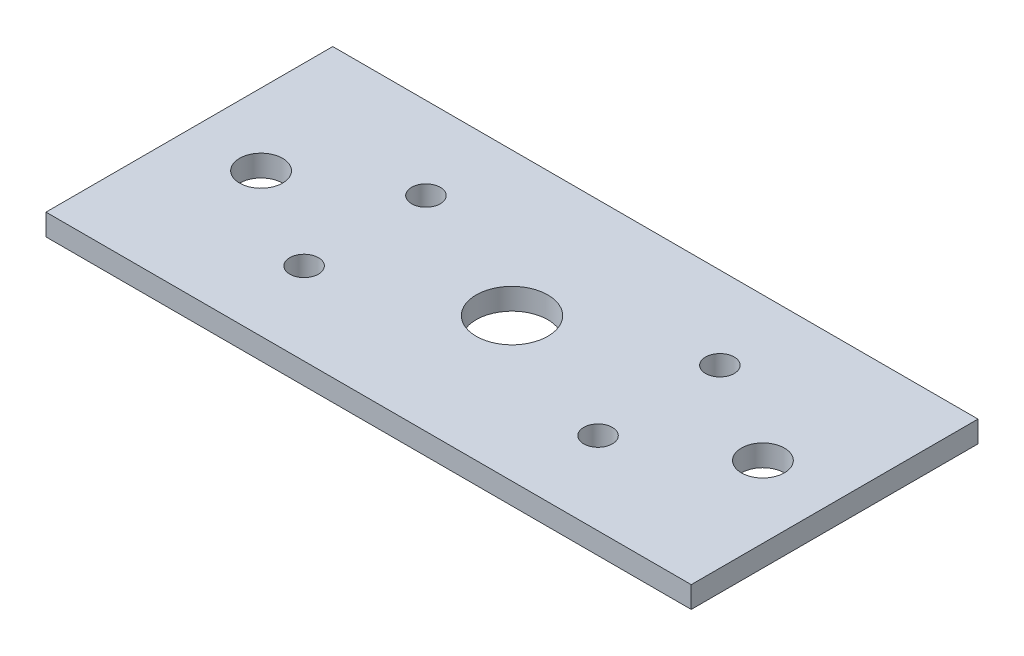
ISO-10303-21;
HEADER;
FILE_DESCRIPTION(('STEP AP214'),'2;1');
FILE_NAME('part.step','',(''),(''),'','','');
FILE_SCHEMA(('AUTOMOTIVE_DESIGN { 1 0 10303 214 1 1 1 1 }'));
ENDSEC;
DATA;
#1=APPLICATION_CONTEXT('core data for automotive mechanical design processes');
#2=APPLICATION_PROTOCOL_DEFINITION('international standard','automotive_design',2000,#1);
#3=PRODUCT_CONTEXT('',#1,'mechanical');
#4=PRODUCT('Part','Part','',(#3));
#5=PRODUCT_RELATED_PRODUCT_CATEGORY('part','',(#4));
#6=PRODUCT_DEFINITION_FORMATION('','',#4);
#7=PRODUCT_DEFINITION_CONTEXT('part definition',#1,'design');
#8=PRODUCT_DEFINITION('design','',#6,#7);
#9=PRODUCT_DEFINITION_SHAPE('','',#8);
#10=(LENGTH_UNIT() NAMED_UNIT(*) SI_UNIT(.MILLI.,.METRE.));
#11=(NAMED_UNIT(*) PLANE_ANGLE_UNIT() SI_UNIT($,.RADIAN.));
#12=(NAMED_UNIT(*) SI_UNIT($,.STERADIAN.) SOLID_ANGLE_UNIT());
#13=UNCERTAINTY_MEASURE_WITH_UNIT(LENGTH_MEASURE(1.E-05),#10,'distance_accuracy_value','');
#14=(GEOMETRIC_REPRESENTATION_CONTEXT(3) GLOBAL_UNCERTAINTY_ASSIGNED_CONTEXT((#13)) GLOBAL_UNIT_ASSIGNED_CONTEXT((#10,
#11,#12)) REPRESENTATION_CONTEXT('',''));
#15=CARTESIAN_POINT('',(0.,0.,0.));
#16=DIRECTION('',(0.,0.,1.));
#17=DIRECTION('',(1.,0.,0.));
#18=AXIS2_PLACEMENT_3D('',#15,#16,#17);
#19=CARTESIAN_POINT('',(0.,3.,20.));
#20=DIRECTION('',(0.,0.,-1.));
#21=DIRECTION('',(-1.,0.,0.));
#22=AXIS2_PLACEMENT_3D('',#19,#20,#21);
#23=PLANE('',#22);
#24=DIRECTION('',(1.,0.,0.));
#25=VECTOR('',#24,1.);
#26=CARTESIAN_POINT('',(0.,0.,20.));
#27=LINE('',#26,#25);
#28=CARTESIAN_POINT('',(-45.,0.,20.));
#29=VERTEX_POINT('',#28);
#30=CARTESIAN_POINT('',(45.,0.,20.));
#31=VERTEX_POINT('',#30);
#32=EDGE_CURVE('E123',#29,#31,#27,.T.);
#33=ORIENTED_EDGE('',*,*,#32,.T.);
#34=DIRECTION('',(0.,-1.,0.));
#35=VECTOR('',#34,1.);
#36=CARTESIAN_POINT('',(45.,3.,20.));
#37=LINE('',#36,#35);
#38=CARTESIAN_POINT('',(45.,3.,20.));
#39=VERTEX_POINT('',#38);
#40=EDGE_CURVE('E11',#39,#31,#37,.T.);
#41=ORIENTED_EDGE('',*,*,#40,.F.);
#42=DIRECTION('',(1.,0.,0.));
#43=VECTOR('',#42,1.);
#44=CARTESIAN_POINT('',(0.,3.,20.));
#45=LINE('',#44,#43);
#46=CARTESIAN_POINT('',(-45.,3.,20.));
#47=VERTEX_POINT('',#46);
#48=EDGE_CURVE('E88',#47,#39,#45,.T.);
#49=ORIENTED_EDGE('',*,*,#48,.F.);
#50=DIRECTION('',(0.,-1.,0.));
#51=VECTOR('',#50,1.);
#52=CARTESIAN_POINT('',(-45.,3.,20.));
#53=LINE('',#52,#51);
#54=EDGE_CURVE('E54',#47,#29,#53,.T.);
#55=ORIENTED_EDGE('',*,*,#54,.T.);
#56=EDGE_LOOP('',(#33,#41,#49,#55));
#57=FACE_BOUND('',#56,.T.);
#58=ADVANCED_FACE('F37',(#57),#23,.F.);
#59=CARTESIAN_POINT('',(45.,3.,0.));
#60=DIRECTION('',(-1.,0.,0.));
#61=DIRECTION('',(0.,0.,1.));
#62=AXIS2_PLACEMENT_3D('',#59,#60,#61);
#63=PLANE('',#62);
#64=DIRECTION('',(0.,0.,-1.));
#65=VECTOR('',#64,1.);
#66=CARTESIAN_POINT('',(45.,0.,0.));
#67=LINE('',#66,#65);
#68=CARTESIAN_POINT('',(45.,0.,-20.));
#69=VERTEX_POINT('',#68);
#70=EDGE_CURVE('E93',#31,#69,#67,.T.);
#71=ORIENTED_EDGE('',*,*,#70,.T.);
#72=DIRECTION('',(0.,-1.,0.));
#73=VECTOR('',#72,1.);
#74=CARTESIAN_POINT('',(45.,3.,-20.));
#75=LINE('',#74,#73);
#76=CARTESIAN_POINT('',(45.,3.,-20.));
#77=VERTEX_POINT('',#76);
#78=EDGE_CURVE('E46',#77,#69,#75,.T.);
#79=ORIENTED_EDGE('',*,*,#78,.F.);
#80=DIRECTION('',(0.,0.,-1.));
#81=VECTOR('',#80,1.);
#82=CARTESIAN_POINT('',(45.,3.,0.));
#83=LINE('',#82,#81);
#84=EDGE_CURVE('E79',#39,#77,#83,.T.);
#85=ORIENTED_EDGE('',*,*,#84,.F.);
#86=ORIENTED_EDGE('',*,*,#40,.T.);
#87=EDGE_LOOP('',(#71,#79,#85,#86));
#88=FACE_BOUND('',#87,.T.);
#89=ADVANCED_FACE('F92',(#88),#63,.F.);
#90=CARTESIAN_POINT('',(0.,3.,-20.));
#91=DIRECTION('',(0.,0.,-1.));
#92=DIRECTION('',(-1.,0.,0.));
#93=AXIS2_PLACEMENT_3D('',#90,#91,#92);
#94=PLANE('',#93);
#95=DIRECTION('',(1.,0.,0.));
#96=VECTOR('',#95,1.);
#97=CARTESIAN_POINT('',(0.,0.,-20.));
#98=LINE('',#97,#96);
#99=CARTESIAN_POINT('',(-45.,0.,-20.));
#100=VERTEX_POINT('',#99);
#101=EDGE_CURVE('E126',#100,#69,#98,.T.);
#102=ORIENTED_EDGE('',*,*,#101,.F.);
#103=DIRECTION('',(0.,-1.,0.));
#104=VECTOR('',#103,1.);
#105=CARTESIAN_POINT('',(-45.,3.,-20.));
#106=LINE('',#105,#104);
#107=CARTESIAN_POINT('',(-45.,3.,-20.));
#108=VERTEX_POINT('',#107);
#109=EDGE_CURVE('E68',#108,#100,#106,.T.);
#110=ORIENTED_EDGE('',*,*,#109,.F.);
#111=DIRECTION('',(1.,0.,0.));
#112=VECTOR('',#111,1.);
#113=CARTESIAN_POINT('',(0.,3.,-20.));
#114=LINE('',#113,#112);
#115=EDGE_CURVE('E87',#108,#77,#114,.T.);
#116=ORIENTED_EDGE('',*,*,#115,.T.);
#117=ORIENTED_EDGE('',*,*,#78,.T.);
#118=EDGE_LOOP('',(#102,#110,#116,#117));
#119=FACE_BOUND('',#118,.T.);
#120=ADVANCED_FACE('F96',(#119),#94,.T.);
#121=CARTESIAN_POINT('',(-45.,3.,0.));
#122=DIRECTION('',(-1.,0.,0.));
#123=DIRECTION('',(0.,0.,1.));
#124=AXIS2_PLACEMENT_3D('',#121,#122,#123);
#125=PLANE('',#124);
#126=DIRECTION('',(0.,0.,-1.));
#127=VECTOR('',#126,1.);
#128=CARTESIAN_POINT('',(-45.,0.,0.));
#129=LINE('',#128,#127);
#130=EDGE_CURVE('E128',#29,#100,#129,.T.);
#131=ORIENTED_EDGE('',*,*,#130,.F.);
#132=ORIENTED_EDGE('',*,*,#54,.F.);
#133=DIRECTION('',(0.,0.,-1.));
#134=VECTOR('',#133,1.);
#135=CARTESIAN_POINT('',(-45.,3.,0.));
#136=LINE('',#135,#134);
#137=EDGE_CURVE('E97',#47,#108,#136,.T.);
#138=ORIENTED_EDGE('',*,*,#137,.T.);
#139=ORIENTED_EDGE('',*,*,#109,.T.);
#140=EDGE_LOOP('',(#131,#132,#138,#139));
#141=FACE_BOUND('',#140,.T.);
#142=ADVANCED_FACE('F187',(#141),#125,.T.);
#143=CARTESIAN_POINT('',(20.5,3.,8.5));
#144=DIRECTION('',(0.,-1.,0.));
#145=DIRECTION('',(0.,0.,-1.));
#146=AXIS2_PLACEMENT_3D('',#143,#144,#145);
#147=CYLINDRICAL_SURFACE('',#146,2.);
#148=CARTESIAN_POINT('',(20.5,3.,8.5));
#149=DIRECTION('',(0.,1.,0.));
#150=DIRECTION('',(0.,0.,1.));
#151=AXIS2_PLACEMENT_3D('',#148,#149,#150);
#152=CIRCLE('',#151,2.);
#153=CARTESIAN_POINT('',(20.5,3.,10.5));
#154=VERTEX_POINT('',#153);
#155=EDGE_CURVE('E155',#154,#154,#152,.T.);
#156=ORIENTED_EDGE('',*,*,#155,.T.);
#157=EDGE_LOOP('',(#156));
#158=FACE_BOUND('',#157,.T.);
#159=CARTESIAN_POINT('',(20.5,0.,8.5));
#160=DIRECTION('',(0.,1.,0.));
#161=DIRECTION('',(0.,0.,1.));
#162=AXIS2_PLACEMENT_3D('',#159,#160,#161);
#163=CIRCLE('',#162,2.);
#164=CARTESIAN_POINT('',(20.5,0.,10.5));
#165=VERTEX_POINT('',#164);
#166=EDGE_CURVE('E120',#165,#165,#163,.T.);
#167=ORIENTED_EDGE('',*,*,#166,.F.);
#168=EDGE_LOOP('',(#167));
#169=FACE_BOUND('',#168,.T.);
#170=ADVANCED_FACE('F159',(#158,#169),#147,.F.);
#171=CARTESIAN_POINT('',(-35.,3.,0.));
#172=DIRECTION('',(0.,-1.,0.));
#173=DIRECTION('',(0.,0.,-1.));
#174=AXIS2_PLACEMENT_3D('',#171,#172,#173);
#175=CYLINDRICAL_SURFACE('',#174,3.00000000000001);
#176=CARTESIAN_POINT('',(-35.,3.,0.));
#177=DIRECTION('',(0.,1.,0.));
#178=DIRECTION('',(0.,0.,1.));
#179=AXIS2_PLACEMENT_3D('',#176,#177,#178);
#180=CIRCLE('',#179,3.00000000000001);
#181=CARTESIAN_POINT('',(-35.,3.,3.00000000000001));
#182=VERTEX_POINT('',#181);
#183=EDGE_CURVE('E152',#182,#182,#180,.T.);
#184=ORIENTED_EDGE('',*,*,#183,.T.);
#185=EDGE_LOOP('',(#184));
#186=FACE_BOUND('',#185,.T.);
#187=CARTESIAN_POINT('',(-35.,0.,0.));
#188=DIRECTION('',(0.,1.,0.));
#189=DIRECTION('',(0.,0.,1.));
#190=AXIS2_PLACEMENT_3D('',#187,#188,#189);
#191=CIRCLE('',#190,3.00000000000001);
#192=CARTESIAN_POINT('',(-35.,0.,3.00000000000001));
#193=VERTEX_POINT('',#192);
#194=EDGE_CURVE('E117',#193,#193,#191,.T.);
#195=ORIENTED_EDGE('',*,*,#194,.F.);
#196=EDGE_LOOP('',(#195));
#197=FACE_BOUND('',#196,.T.);
#198=ADVANCED_FACE('F186',(#186,#197),#175,.F.);
#199=CARTESIAN_POINT('',(35.,3.,0.));
#200=DIRECTION('',(0.,-1.,0.));
#201=DIRECTION('',(0.,0.,-1.));
#202=AXIS2_PLACEMENT_3D('',#199,#200,#201);
#203=CYLINDRICAL_SURFACE('',#202,3.00000000000001);
#204=CARTESIAN_POINT('',(35.,3.,0.));
#205=DIRECTION('',(0.,1.,0.));
#206=DIRECTION('',(0.,0.,1.));
#207=AXIS2_PLACEMENT_3D('',#204,#205,#206);
#208=CIRCLE('',#207,3.00000000000001);
#209=CARTESIAN_POINT('',(35.,3.,3.00000000000002));
#210=VERTEX_POINT('',#209);
#211=EDGE_CURVE('E149',#210,#210,#208,.T.);
#212=ORIENTED_EDGE('',*,*,#211,.T.);
#213=EDGE_LOOP('',(#212));
#214=FACE_BOUND('',#213,.T.);
#215=CARTESIAN_POINT('',(35.,0.,0.));
#216=DIRECTION('',(0.,1.,0.));
#217=DIRECTION('',(0.,0.,1.));
#218=AXIS2_PLACEMENT_3D('',#215,#216,#217);
#219=CIRCLE('',#218,3.00000000000001);
#220=CARTESIAN_POINT('',(35.,0.,3.00000000000002));
#221=VERTEX_POINT('',#220);
#222=EDGE_CURVE('E114',#221,#221,#219,.T.);
#223=ORIENTED_EDGE('',*,*,#222,.F.);
#224=EDGE_LOOP('',(#223));
#225=FACE_BOUND('',#224,.T.);
#226=ADVANCED_FACE('F190',(#214,#225),#203,.F.);
#227=CARTESIAN_POINT('',(-20.5,3.,8.5));
#228=DIRECTION('',(0.,-1.,0.));
#229=DIRECTION('',(0.,0.,-1.));
#230=AXIS2_PLACEMENT_3D('',#227,#228,#229);
#231=CYLINDRICAL_SURFACE('',#230,2.);
#232=CARTESIAN_POINT('',(-20.5,3.,8.5));
#233=DIRECTION('',(0.,1.,0.));
#234=DIRECTION('',(0.,0.,1.));
#235=AXIS2_PLACEMENT_3D('',#232,#233,#234);
#236=CIRCLE('',#235,2.);
#237=CARTESIAN_POINT('',(-20.5,3.,10.5));
#238=VERTEX_POINT('',#237);
#239=EDGE_CURVE('E144',#238,#238,#236,.T.);
#240=ORIENTED_EDGE('',*,*,#239,.T.);
#241=EDGE_LOOP('',(#240));
#242=FACE_BOUND('',#241,.T.);
#243=CARTESIAN_POINT('',(-20.5,0.,8.5));
#244=DIRECTION('',(0.,1.,0.));
#245=DIRECTION('',(0.,0.,1.));
#246=AXIS2_PLACEMENT_3D('',#243,#244,#245);
#247=CIRCLE('',#246,2.);
#248=CARTESIAN_POINT('',(-20.5,0.,10.5));
#249=VERTEX_POINT('',#248);
#250=EDGE_CURVE('E111',#249,#249,#247,.T.);
#251=ORIENTED_EDGE('',*,*,#250,.F.);
#252=EDGE_LOOP('',(#251));
#253=FACE_BOUND('',#252,.T.);
#254=ADVANCED_FACE('F194',(#242,#253),#231,.F.);
#255=CARTESIAN_POINT('',(20.5,3.,-8.5));
#256=DIRECTION('',(0.,-1.,0.));
#257=DIRECTION('',(0.,0.,-1.));
#258=AXIS2_PLACEMENT_3D('',#255,#256,#257);
#259=CYLINDRICAL_SURFACE('',#258,2.);
#260=CARTESIAN_POINT('',(20.5,3.,-8.5));
#261=DIRECTION('',(0.,1.,0.));
#262=DIRECTION('',(0.,0.,1.));
#263=AXIS2_PLACEMENT_3D('',#260,#261,#262);
#264=CIRCLE('',#263,2.);
#265=CARTESIAN_POINT('',(20.5,3.,-6.5));
#266=VERTEX_POINT('',#265);
#267=EDGE_CURVE('E139',#266,#266,#264,.T.);
#268=ORIENTED_EDGE('',*,*,#267,.T.);
#269=EDGE_LOOP('',(#268));
#270=FACE_BOUND('',#269,.T.);
#271=CARTESIAN_POINT('',(20.5,0.,-8.5));
#272=DIRECTION('',(0.,1.,0.));
#273=DIRECTION('',(0.,0.,1.));
#274=AXIS2_PLACEMENT_3D('',#271,#272,#273);
#275=CIRCLE('',#274,2.);
#276=CARTESIAN_POINT('',(20.5,0.,-6.5));
#277=VERTEX_POINT('',#276);
#278=EDGE_CURVE('E108',#277,#277,#275,.T.);
#279=ORIENTED_EDGE('',*,*,#278,.F.);
#280=EDGE_LOOP('',(#279));
#281=FACE_BOUND('',#280,.T.);
#282=ADVANCED_FACE('F197',(#270,#281),#259,.F.);
#283=CARTESIAN_POINT('',(-20.5,3.,-8.5));
#284=DIRECTION('',(0.,-1.,0.));
#285=DIRECTION('',(0.,0.,-1.));
#286=AXIS2_PLACEMENT_3D('',#283,#284,#285);
#287=CYLINDRICAL_SURFACE('',#286,2.);
#288=CARTESIAN_POINT('',(-20.5,3.,-8.5));
#289=DIRECTION('',(0.,1.,0.));
#290=DIRECTION('',(0.,0.,1.));
#291=AXIS2_PLACEMENT_3D('',#288,#289,#290);
#292=CIRCLE('',#291,2.);
#293=CARTESIAN_POINT('',(-20.5,3.,-6.5));
#294=VERTEX_POINT('',#293);
#295=EDGE_CURVE('E134',#294,#294,#292,.T.);
#296=ORIENTED_EDGE('',*,*,#295,.T.);
#297=EDGE_LOOP('',(#296));
#298=FACE_BOUND('',#297,.T.);
#299=CARTESIAN_POINT('',(-20.5,0.,-8.5));
#300=DIRECTION('',(0.,1.,0.));
#301=DIRECTION('',(0.,0.,1.));
#302=AXIS2_PLACEMENT_3D('',#299,#300,#301);
#303=CIRCLE('',#302,2.);
#304=CARTESIAN_POINT('',(-20.5,0.,-6.5));
#305=VERTEX_POINT('',#304);
#306=EDGE_CURVE('E105',#305,#305,#303,.T.);
#307=ORIENTED_EDGE('',*,*,#306,.F.);
#308=EDGE_LOOP('',(#307));
#309=FACE_BOUND('',#308,.T.);
#310=ADVANCED_FACE('F39',(#298,#309),#287,.F.);
#311=CARTESIAN_POINT('',(0.,3.,0.));
#312=DIRECTION('',(0.,-1.,0.));
#313=DIRECTION('',(0.,0.,-1.));
#314=AXIS2_PLACEMENT_3D('',#311,#312,#313);
#315=CYLINDRICAL_SURFACE('',#314,5.);
#316=CARTESIAN_POINT('',(0.,3.,0.));
#317=DIRECTION('',(0.,1.,0.));
#318=DIRECTION('',(0.,0.,1.));
#319=AXIS2_PLACEMENT_3D('',#316,#317,#318);
#320=CIRCLE('',#319,5.);
#321=CARTESIAN_POINT('',(0.,3.,5.));
#322=VERTEX_POINT('',#321);
#323=EDGE_CURVE('E99',#322,#322,#320,.T.);
#324=ORIENTED_EDGE('',*,*,#323,.T.);
#325=EDGE_LOOP('',(#324));
#326=FACE_BOUND('',#325,.T.);
#327=CARTESIAN_POINT('',(0.,0.,0.));
#328=DIRECTION('',(0.,1.,0.));
#329=DIRECTION('',(0.,0.,1.));
#330=AXIS2_PLACEMENT_3D('',#327,#328,#329);
#331=CIRCLE('',#330,5.);
#332=CARTESIAN_POINT('',(0.,0.,5.));
#333=VERTEX_POINT('',#332);
#334=EDGE_CURVE('E131',#333,#333,#331,.T.);
#335=ORIENTED_EDGE('',*,*,#334,.F.);
#336=EDGE_LOOP('',(#335));
#337=FACE_BOUND('',#336,.T.);
#338=ADVANCED_FACE('F164',(#326,#337),#315,.F.);
#339=CARTESIAN_POINT('',(0.,3.,0.));
#340=DIRECTION('',(0.,1.,0.));
#341=DIRECTION('',(0.,0.,1.));
#342=AXIS2_PLACEMENT_3D('',#339,#340,#341);
#343=PLANE('',#342);
#344=ORIENTED_EDGE('',*,*,#295,.F.);
#345=EDGE_LOOP('',(#344));
#346=FACE_BOUND('',#345,.T.);
#347=ORIENTED_EDGE('',*,*,#267,.F.);
#348=EDGE_LOOP('',(#347));
#349=FACE_BOUND('',#348,.T.);
#350=ORIENTED_EDGE('',*,*,#239,.F.);
#351=EDGE_LOOP('',(#350));
#352=FACE_BOUND('',#351,.T.);
#353=ORIENTED_EDGE('',*,*,#211,.F.);
#354=EDGE_LOOP('',(#353));
#355=FACE_BOUND('',#354,.T.);
#356=ORIENTED_EDGE('',*,*,#183,.F.);
#357=EDGE_LOOP('',(#356));
#358=FACE_BOUND('',#357,.T.);
#359=ORIENTED_EDGE('',*,*,#155,.F.);
#360=EDGE_LOOP('',(#359));
#361=FACE_BOUND('',#360,.T.);
#362=ORIENTED_EDGE('',*,*,#48,.T.);
#363=ORIENTED_EDGE('',*,*,#84,.T.);
#364=ORIENTED_EDGE('',*,*,#115,.F.);
#365=ORIENTED_EDGE('',*,*,#137,.F.);
#366=EDGE_LOOP('',(#362,#363,#364,#365));
#367=FACE_BOUND('',#366,.T.);
#368=ORIENTED_EDGE('',*,*,#323,.F.);
#369=EDGE_LOOP('',(#368));
#370=FACE_BOUND('',#369,.T.);
#371=ADVANCED_FACE('F83',(#346,#349,#352,#355,#358,#361,#367,#370),#343,.T.);
#372=CARTESIAN_POINT('',(0.,0.,0.));
#373=DIRECTION('',(0.,1.,0.));
#374=DIRECTION('',(0.,0.,1.));
#375=AXIS2_PLACEMENT_3D('',#372,#373,#374);
#376=PLANE('',#375);
#377=ORIENTED_EDGE('',*,*,#306,.T.);
#378=EDGE_LOOP('',(#377));
#379=FACE_BOUND('',#378,.T.);
#380=ORIENTED_EDGE('',*,*,#278,.T.);
#381=EDGE_LOOP('',(#380));
#382=FACE_BOUND('',#381,.T.);
#383=ORIENTED_EDGE('',*,*,#250,.T.);
#384=EDGE_LOOP('',(#383));
#385=FACE_BOUND('',#384,.T.);
#386=ORIENTED_EDGE('',*,*,#222,.T.);
#387=EDGE_LOOP('',(#386));
#388=FACE_BOUND('',#387,.T.);
#389=ORIENTED_EDGE('',*,*,#194,.T.);
#390=EDGE_LOOP('',(#389));
#391=FACE_BOUND('',#390,.T.);
#392=ORIENTED_EDGE('',*,*,#166,.T.);
#393=EDGE_LOOP('',(#392));
#394=FACE_BOUND('',#393,.T.);
#395=ORIENTED_EDGE('',*,*,#32,.F.);
#396=ORIENTED_EDGE('',*,*,#130,.T.);
#397=ORIENTED_EDGE('',*,*,#101,.T.);
#398=ORIENTED_EDGE('',*,*,#70,.F.);
#399=EDGE_LOOP('',(#395,#396,#397,#398));
#400=FACE_BOUND('',#399,.T.);
#401=ORIENTED_EDGE('',*,*,#334,.T.);
#402=EDGE_LOOP('',(#401));
#403=FACE_BOUND('',#402,.T.);
#404=ADVANCED_FACE('F163',(#379,#382,#385,#388,#391,#394,#400,#403),#376,.F.);
#405=CLOSED_SHELL('',(#58,#89,#120,#142,#170,#198,#226,#254,#282,#310,#338,#371,#404));
#406=MANIFOLD_SOLID_BREP('B2',#405);
#407=ADVANCED_BREP_SHAPE_REPRESENTATION('',(#18,#406),#14);
#408=SHAPE_DEFINITION_REPRESENTATION(#9,#407);
ENDSEC;
END-ISO-10303-21;
